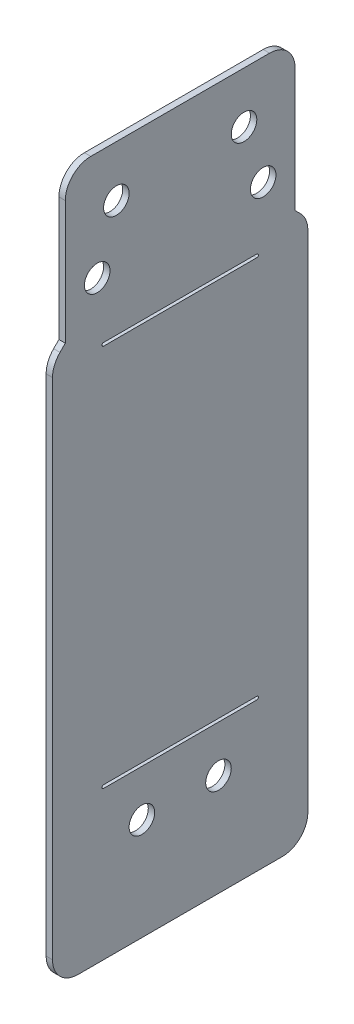
ISO-10303-21;
HEADER;
FILE_DESCRIPTION(('STEP AP214'),'2;1');
FILE_NAME('part.step','',(''),(''),'','','');
FILE_SCHEMA(('AUTOMOTIVE_DESIGN { 1 0 10303 214 1 1 1 1 }'));
ENDSEC;
DATA;
#1=APPLICATION_CONTEXT('core data for automotive mechanical design processes');
#2=APPLICATION_PROTOCOL_DEFINITION('international standard','automotive_design',2000,#1);
#3=PRODUCT_CONTEXT('',#1,'mechanical');
#4=PRODUCT('Part','Part','',(#3));
#5=PRODUCT_RELATED_PRODUCT_CATEGORY('part','',(#4));
#6=PRODUCT_DEFINITION_FORMATION('','',#4);
#7=PRODUCT_DEFINITION_CONTEXT('part definition',#1,'design');
#8=PRODUCT_DEFINITION('design','',#6,#7);
#9=PRODUCT_DEFINITION_SHAPE('','',#8);
#10=(LENGTH_UNIT() NAMED_UNIT(*) SI_UNIT(.MILLI.,.METRE.));
#11=(NAMED_UNIT(*) PLANE_ANGLE_UNIT() SI_UNIT($,.RADIAN.));
#12=(NAMED_UNIT(*) SI_UNIT($,.STERADIAN.) SOLID_ANGLE_UNIT());
#13=UNCERTAINTY_MEASURE_WITH_UNIT(LENGTH_MEASURE(1.E-05),#10,'distance_accuracy_value','');
#14=(GEOMETRIC_REPRESENTATION_CONTEXT(3) GLOBAL_UNCERTAINTY_ASSIGNED_CONTEXT((#13)) GLOBAL_UNIT_ASSIGNED_CONTEXT((#10,
#11,#12)) REPRESENTATION_CONTEXT('',''));
#15=CARTESIAN_POINT('',(0.,0.,0.));
#16=DIRECTION('',(0.,0.,1.));
#17=DIRECTION('',(1.,0.,0.));
#18=AXIS2_PLACEMENT_3D('',#15,#16,#17);
#19=CARTESIAN_POINT('',(1.,0.,-18.));
#20=DIRECTION('',(0.,0.,-1.));
#21=DIRECTION('',(0.,1.,0.));
#22=AXIS2_PLACEMENT_3D('',#19,#20,#21);
#23=PLANE('',#22);
#24=DIRECTION('',(0.,-1.,0.));
#25=VECTOR('',#24,1.);
#26=CARTESIAN_POINT('',(0.,0.,-18.));
#27=LINE('',#26,#25);
#28=CARTESIAN_POINT('',(0.,-3.99999999999999,-18.));
#29=VERTEX_POINT('',#28);
#30=CARTESIAN_POINT('',(0.,-23.35,-18.));
#31=VERTEX_POINT('',#30);
#32=EDGE_CURVE('E340',#29,#31,#27,.T.);
#33=ORIENTED_EDGE('',*,*,#32,.F.);
#34=DIRECTION('',(-1.,0.,0.));
#35=VECTOR('',#34,1.);
#36=CARTESIAN_POINT('',(1.,-3.99999999999999,-18.));
#37=LINE('',#36,#35);
#38=CARTESIAN_POINT('',(1.,-3.99999999999999,-18.));
#39=VERTEX_POINT('',#38);
#40=EDGE_CURVE('E362',#29,#39,#37,.F.);
#41=ORIENTED_EDGE('',*,*,#40,.T.);
#42=DIRECTION('',(0.,-1.,0.));
#43=VECTOR('',#42,1.);
#44=CARTESIAN_POINT('',(1.,0.,-18.));
#45=LINE('',#44,#43);
#46=CARTESIAN_POINT('',(1.00000000000003,-23.35,-18.));
#47=VERTEX_POINT('',#46);
#48=EDGE_CURVE('E328',#39,#47,#45,.T.);
#49=ORIENTED_EDGE('',*,*,#48,.T.);
#50=DIRECTION('',(-1.,0.,0.));
#51=VECTOR('',#50,1.);
#52=CARTESIAN_POINT('',(87.6730782884743,-23.35,-18.));
#53=LINE('',#52,#51);
#54=EDGE_CURVE('E265',#47,#31,#53,.T.);
#55=ORIENTED_EDGE('',*,*,#54,.T.);
#56=EDGE_LOOP('',(#33,#41,#49,#55));
#57=FACE_BOUND('',#56,.T.);
#58=ADVANCED_FACE('F36',(#57),#23,.T.);
#59=CARTESIAN_POINT('',(1.,0.,18.));
#60=DIRECTION('',(0.,0.,-1.));
#61=DIRECTION('',(0.,1.,0.));
#62=AXIS2_PLACEMENT_3D('',#59,#60,#61);
#63=PLANE('',#62);
#64=DIRECTION('',(0.,-1.,0.));
#65=VECTOR('',#64,1.);
#66=CARTESIAN_POINT('',(1.,0.,18.));
#67=LINE('',#66,#65);
#68=CARTESIAN_POINT('',(1.,-4.,18.));
#69=VERTEX_POINT('',#68);
#70=CARTESIAN_POINT('',(1.,-23.35,18.));
#71=VERTEX_POINT('',#70);
#72=EDGE_CURVE('E335',#69,#71,#67,.T.);
#73=ORIENTED_EDGE('',*,*,#72,.F.);
#74=DIRECTION('',(-1.,0.,0.));
#75=VECTOR('',#74,1.);
#76=CARTESIAN_POINT('',(0.,-4.,18.));
#77=LINE('',#76,#75);
#78=CARTESIAN_POINT('',(0.,-4.,18.));
#79=VERTEX_POINT('',#78);
#80=EDGE_CURVE('E337',#69,#79,#77,.T.);
#81=ORIENTED_EDGE('',*,*,#80,.T.);
#82=DIRECTION('',(0.,-1.,0.));
#83=VECTOR('',#82,1.);
#84=CARTESIAN_POINT('',(0.,0.,18.));
#85=LINE('',#84,#83);
#86=CARTESIAN_POINT('',(0.,-23.35,18.));
#87=VERTEX_POINT('',#86);
#88=EDGE_CURVE('E329',#79,#87,#85,.T.);
#89=ORIENTED_EDGE('',*,*,#88,.T.);
#90=DIRECTION('',(-1.,0.,0.));
#91=VECTOR('',#90,1.);
#92=CARTESIAN_POINT('',(87.6730782884743,-23.35,18.));
#93=LINE('',#92,#91);
#94=EDGE_CURVE('E279',#71,#87,#93,.T.);
#95=ORIENTED_EDGE('',*,*,#94,.F.);
#96=EDGE_LOOP('',(#73,#81,#89,#95));
#97=FACE_BOUND('',#96,.T.);
#98=ADVANCED_FACE('F436',(#97),#63,.F.);
#99=CARTESIAN_POINT('',(1.,0.,18.));
#100=DIRECTION('',(0.,1.,0.));
#101=DIRECTION('',(0.,0.,1.));
#102=AXIS2_PLACEMENT_3D('',#99,#100,#101);
#103=PLANE('',#102);
#104=DIRECTION('',(0.,0.,-1.));
#105=VECTOR('',#104,1.);
#106=CARTESIAN_POINT('',(0.,0.,18.));
#107=LINE('',#106,#105);
#108=CARTESIAN_POINT('',(0.,0.,14.));
#109=VERTEX_POINT('',#108);
#110=CARTESIAN_POINT('',(0.,0.,-14.));
#111=VERTEX_POINT('',#110);
#112=EDGE_CURVE('E324',#109,#111,#107,.T.);
#113=ORIENTED_EDGE('',*,*,#112,.F.);
#114=DIRECTION('',(-1.,0.,0.));
#115=VECTOR('',#114,1.);
#116=CARTESIAN_POINT('',(1.,0.,14.));
#117=LINE('',#116,#115);
#118=CARTESIAN_POINT('',(1.,0.,14.));
#119=VERTEX_POINT('',#118);
#120=EDGE_CURVE('E356',#109,#119,#117,.F.);
#121=ORIENTED_EDGE('',*,*,#120,.T.);
#122=DIRECTION('',(0.,0.,-1.));
#123=VECTOR('',#122,1.);
#124=CARTESIAN_POINT('',(1.,0.,18.));
#125=LINE('',#124,#123);
#126=CARTESIAN_POINT('',(1.,0.,-14.));
#127=VERTEX_POINT('',#126);
#128=EDGE_CURVE('E325',#119,#127,#125,.T.);
#129=ORIENTED_EDGE('',*,*,#128,.T.);
#130=DIRECTION('',(-1.,0.,0.));
#131=VECTOR('',#130,1.);
#132=CARTESIAN_POINT('',(1.,0.,-14.));
#133=LINE('',#132,#131);
#134=EDGE_CURVE('E353',#127,#111,#133,.T.);
#135=ORIENTED_EDGE('',*,*,#134,.T.);
#136=EDGE_LOOP('',(#113,#121,#129,#135));
#137=FACE_BOUND('',#136,.T.);
#138=ADVANCED_FACE('F428',(#137),#103,.T.);
#139=CARTESIAN_POINT('',(1.,-110.,18.));
#140=DIRECTION('',(0.,1.,0.));
#141=DIRECTION('',(0.,0.,1.));
#142=AXIS2_PLACEMENT_3D('',#139,#140,#141);
#143=PLANE('',#142);
#144=DIRECTION('',(0.,0.,-1.));
#145=VECTOR('',#144,1.);
#146=CARTESIAN_POINT('',(0.,-110.,18.));
#147=LINE('',#146,#145);
#148=CARTESIAN_POINT('',(0.,-110.,16.));
#149=VERTEX_POINT('',#148);
#150=CARTESIAN_POINT('',(0.,-110.,-16.));
#151=VERTEX_POINT('',#150);
#152=EDGE_CURVE('E342',#149,#151,#147,.T.);
#153=ORIENTED_EDGE('',*,*,#152,.T.);
#154=DIRECTION('',(-1.,0.,0.));
#155=VECTOR('',#154,1.);
#156=CARTESIAN_POINT('',(1.,-110.,-16.));
#157=LINE('',#156,#155);
#158=CARTESIAN_POINT('',(1.,-110.,-16.));
#159=VERTEX_POINT('',#158);
#160=EDGE_CURVE('E11',#151,#159,#157,.F.);
#161=ORIENTED_EDGE('',*,*,#160,.T.);
#162=DIRECTION('',(0.,0.,-1.));
#163=VECTOR('',#162,1.);
#164=CARTESIAN_POINT('',(1.,-110.,18.));
#165=LINE('',#164,#163);
#166=CARTESIAN_POINT('',(1.,-110.,16.));
#167=VERTEX_POINT('',#166);
#168=EDGE_CURVE('E332',#167,#159,#165,.T.);
#169=ORIENTED_EDGE('',*,*,#168,.F.);
#170=DIRECTION('',(-1.,0.,0.));
#171=VECTOR('',#170,1.);
#172=CARTESIAN_POINT('',(0.,-110.,16.));
#173=LINE('',#172,#171);
#174=EDGE_CURVE('E44',#167,#149,#173,.T.);
#175=ORIENTED_EDGE('',*,*,#174,.T.);
#176=EDGE_LOOP('',(#153,#161,#169,#175));
#177=FACE_BOUND('',#176,.T.);
#178=ADVANCED_FACE('F397',(#177),#143,.F.);
#179=CARTESIAN_POINT('',(1.,0.,0.));
#180=DIRECTION('',(-1.,0.,0.));
#181=DIRECTION('',(0.,0.,1.));
#182=AXIS2_PLACEMENT_3D('',#179,#180,#181);
#183=PLANE('',#182);
#184=DIRECTION('',(0.,0.,1.));
#185=VECTOR('',#184,1.);
#186=CARTESIAN_POINT('',(1.00000000000003,-86.75,12.));
#187=LINE('',#186,#185);
#188=CARTESIAN_POINT('',(1.00000000000003,-86.75,-12.));
#189=VERTEX_POINT('',#188);
#190=CARTESIAN_POINT('',(1.00000000000003,-86.75,12.));
#191=VERTEX_POINT('',#190);
#192=EDGE_CURVE('E198',#189,#191,#187,.T.);
#193=ORIENTED_EDGE('',*,*,#192,.T.);
#194=CARTESIAN_POINT('',(1.00000000000003,-86.5,12.));
#195=DIRECTION('',(-1.,0.,0.));
#196=DIRECTION('',(0.,0.,1.));
#197=AXIS2_PLACEMENT_3D('',#194,#195,#196);
#198=CIRCLE('',#197,0.250000000000014);
#199=CARTESIAN_POINT('',(1.00000000000003,-86.25,12.));
#200=VERTEX_POINT('',#199);
#201=EDGE_CURVE('E190',#191,#200,#198,.T.);
#202=ORIENTED_EDGE('',*,*,#201,.T.);
#203=DIRECTION('',(0.,0.,-1.));
#204=VECTOR('',#203,1.);
#205=CARTESIAN_POINT('',(1.00000000000003,-86.25,12.));
#206=LINE('',#205,#204);
#207=CARTESIAN_POINT('',(1.,-86.25,-12.));
#208=VERTEX_POINT('',#207);
#209=EDGE_CURVE('E202',#200,#208,#206,.T.);
#210=ORIENTED_EDGE('',*,*,#209,.T.);
#211=CARTESIAN_POINT('',(1.00000000000003,-86.5,-12.));
#212=DIRECTION('',(-1.,0.,0.));
#213=DIRECTION('',(0.,0.,1.));
#214=AXIS2_PLACEMENT_3D('',#211,#212,#213);
#215=CIRCLE('',#214,0.250000000000014);
#216=EDGE_CURVE('E206',#208,#189,#215,.T.);
#217=ORIENTED_EDGE('',*,*,#216,.T.);
#218=EDGE_LOOP('',(#193,#202,#210,#217));
#219=FACE_BOUND('',#218,.T.);
#220=DIRECTION('',(0.,0.,1.));
#221=VECTOR('',#220,1.);
#222=CARTESIAN_POINT('',(1.00000000000003,-26.75,12.));
#223=LINE('',#222,#221);
#224=CARTESIAN_POINT('',(1.00000000000003,-26.75,-12.));
#225=VERTEX_POINT('',#224);
#226=CARTESIAN_POINT('',(1.00000000000003,-26.75,12.));
#227=VERTEX_POINT('',#226);
#228=EDGE_CURVE('E241',#225,#227,#223,.T.);
#229=ORIENTED_EDGE('',*,*,#228,.T.);
#230=CARTESIAN_POINT('',(1.00000000000003,-26.5,12.));
#231=DIRECTION('',(-1.,0.,0.));
#232=DIRECTION('',(0.,0.,1.));
#233=AXIS2_PLACEMENT_3D('',#230,#231,#232);
#234=CIRCLE('',#233,0.25);
#235=CARTESIAN_POINT('',(1.00000000000003,-26.25,12.));
#236=VERTEX_POINT('',#235);
#237=EDGE_CURVE('E231',#227,#236,#234,.T.);
#238=ORIENTED_EDGE('',*,*,#237,.T.);
#239=DIRECTION('',(0.,0.,-1.));
#240=VECTOR('',#239,1.);
#241=CARTESIAN_POINT('',(1.00000000000003,-26.25,12.));
#242=LINE('',#241,#240);
#243=CARTESIAN_POINT('',(1.,-26.25,-12.));
#244=VERTEX_POINT('',#243);
#245=EDGE_CURVE('E234',#236,#244,#242,.T.);
#246=ORIENTED_EDGE('',*,*,#245,.T.);
#247=CARTESIAN_POINT('',(1.00000000000003,-26.5,-12.));
#248=DIRECTION('',(-1.,0.,0.));
#249=DIRECTION('',(0.,0.,1.));
#250=AXIS2_PLACEMENT_3D('',#247,#248,#249);
#251=CIRCLE('',#250,0.25);
#252=EDGE_CURVE('E238',#244,#225,#251,.T.);
#253=ORIENTED_EDGE('',*,*,#252,.T.);
#254=EDGE_LOOP('',(#229,#238,#246,#253));
#255=FACE_BOUND('',#254,.T.);
#256=CARTESIAN_POINT('',(1.,-94.,-6.00000000000001));
#257=DIRECTION('',(1.,0.,0.));
#258=DIRECTION('',(0.,0.,-1.));
#259=AXIS2_PLACEMENT_3D('',#256,#257,#258);
#260=CIRCLE('',#259,2.);
#261=CARTESIAN_POINT('',(1.,-94.,-8.00000000000001));
#262=VERTEX_POINT('',#261);
#263=EDGE_CURVE('E282',#262,#262,#260,.T.);
#264=ORIENTED_EDGE('',*,*,#263,.F.);
#265=EDGE_LOOP('',(#264));
#266=FACE_BOUND('',#265,.T.);
#267=CARTESIAN_POINT('',(1.,-94.,5.99999999999999));
#268=DIRECTION('',(1.,0.,0.));
#269=DIRECTION('',(0.,0.,-1.));
#270=AXIS2_PLACEMENT_3D('',#267,#268,#269);
#271=CIRCLE('',#270,2.);
#272=CARTESIAN_POINT('',(1.,-94.,3.99999999999999));
#273=VERTEX_POINT('',#272);
#274=EDGE_CURVE('E294',#273,#273,#271,.T.);
#275=ORIENTED_EDGE('',*,*,#274,.F.);
#276=EDGE_LOOP('',(#275));
#277=FACE_BOUND('',#276,.T.);
#278=CARTESIAN_POINT('',(1.,-17.,-13.));
#279=DIRECTION('',(-1.,0.,0.));
#280=DIRECTION('',(0.,0.,1.));
#281=AXIS2_PLACEMENT_3D('',#278,#279,#280);
#282=CIRCLE('',#281,2.);
#283=CARTESIAN_POINT('',(1.,-17.,-11.));
#284=VERTEX_POINT('',#283);
#285=EDGE_CURVE('E303',#284,#284,#282,.T.);
#286=ORIENTED_EDGE('',*,*,#285,.T.);
#287=EDGE_LOOP('',(#286));
#288=FACE_BOUND('',#287,.T.);
#289=CARTESIAN_POINT('',(1.,-17.,13.));
#290=DIRECTION('',(-1.,0.,0.));
#291=DIRECTION('',(0.,0.,1.));
#292=AXIS2_PLACEMENT_3D('',#289,#290,#291);
#293=CIRCLE('',#292,2.);
#294=CARTESIAN_POINT('',(1.,-17.,15.));
#295=VERTEX_POINT('',#294);
#296=EDGE_CURVE('E309',#295,#295,#293,.T.);
#297=ORIENTED_EDGE('',*,*,#296,.T.);
#298=EDGE_LOOP('',(#297));
#299=FACE_BOUND('',#298,.T.);
#300=CARTESIAN_POINT('',(1.,-8.,-9.99999999999999));
#301=DIRECTION('',(-1.,0.,0.));
#302=DIRECTION('',(0.,0.,1.));
#303=AXIS2_PLACEMENT_3D('',#300,#301,#302);
#304=CIRCLE('',#303,2.);
#305=CARTESIAN_POINT('',(1.,-8.,-7.99999999999999));
#306=VERTEX_POINT('',#305);
#307=EDGE_CURVE('E315',#306,#306,#304,.T.);
#308=ORIENTED_EDGE('',*,*,#307,.T.);
#309=EDGE_LOOP('',(#308));
#310=FACE_BOUND('',#309,.T.);
#311=CARTESIAN_POINT('',(1.,-8.,10.));
#312=DIRECTION('',(-1.,0.,0.));
#313=DIRECTION('',(0.,0.,1.));
#314=AXIS2_PLACEMENT_3D('',#311,#312,#313);
#315=CIRCLE('',#314,2.);
#316=CARTESIAN_POINT('',(1.,-8.,12.));
#317=VERTEX_POINT('',#316);
#318=EDGE_CURVE('E321',#317,#317,#315,.T.);
#319=ORIENTED_EDGE('',*,*,#318,.T.);
#320=EDGE_LOOP('',(#319));
#321=FACE_BOUND('',#320,.T.);
#322=DIRECTION('',(0.,-0.707106781186551,0.707106781186544));
#323=VECTOR('',#322,1.);
#324=CARTESIAN_POINT('',(1.,-23.35,18.));
#325=LINE('',#324,#323);
#326=CARTESIAN_POINT('',(1.,-24.1784271247462,18.8284271247462));
#327=VERTEX_POINT('',#326);
#328=EDGE_CURVE('E278',#71,#327,#325,.T.);
#329=ORIENTED_EDGE('',*,*,#328,.T.);
#330=CARTESIAN_POINT('',(1.,-27.0068542494924,16.));
#331=DIRECTION('',(-1.,0.,0.));
#332=DIRECTION('',(0.,0.,1.));
#333=AXIS2_PLACEMENT_3D('',#330,#331,#332);
#334=CIRCLE('',#333,4.);
#335=CARTESIAN_POINT('',(1.,-27.0068542494924,20.));
#336=VERTEX_POINT('',#335);
#337=EDGE_CURVE('E384',#327,#336,#334,.F.);
#338=ORIENTED_EDGE('',*,*,#337,.T.);
#339=DIRECTION('',(0.,-1.,0.));
#340=VECTOR('',#339,1.);
#341=CARTESIAN_POINT('',(1.,-25.35,20.));
#342=LINE('',#341,#340);
#343=CARTESIAN_POINT('',(1.,-106.,20.));
#344=VERTEX_POINT('',#343);
#345=EDGE_CURVE('E275',#336,#344,#342,.T.);
#346=ORIENTED_EDGE('',*,*,#345,.T.);
#347=CARTESIAN_POINT('',(1.,-106.,16.));
#348=DIRECTION('',(-1.,0.,0.));
#349=DIRECTION('',(0.,0.,1.));
#350=AXIS2_PLACEMENT_3D('',#347,#348,#349);
#351=CIRCLE('',#350,4.);
#352=EDGE_CURVE('E379',#344,#167,#351,.F.);
#353=ORIENTED_EDGE('',*,*,#352,.T.);
#354=ORIENTED_EDGE('',*,*,#168,.T.);
#355=CARTESIAN_POINT('',(1.,-106.,-16.));
#356=DIRECTION('',(-1.,0.,0.));
#357=DIRECTION('',(0.,0.,1.));
#358=AXIS2_PLACEMENT_3D('',#355,#356,#357);
#359=CIRCLE('',#358,4.);
#360=CARTESIAN_POINT('',(1.,-106.,-20.));
#361=VERTEX_POINT('',#360);
#362=EDGE_CURVE('E381',#159,#361,#359,.F.);
#363=ORIENTED_EDGE('',*,*,#362,.T.);
#364=DIRECTION('',(0.,1.,0.));
#365=VECTOR('',#364,1.);
#366=CARTESIAN_POINT('',(1.,-25.35,-20.));
#367=LINE('',#366,#365);
#368=CARTESIAN_POINT('',(1.,-27.0068542494924,-20.));
#369=VERTEX_POINT('',#368);
#370=EDGE_CURVE('E264',#361,#369,#367,.T.);
#371=ORIENTED_EDGE('',*,*,#370,.T.);
#372=CARTESIAN_POINT('',(1.,-27.0068542494924,-16.));
#373=DIRECTION('',(-1.,0.,0.));
#374=DIRECTION('',(0.,0.,1.));
#375=AXIS2_PLACEMENT_3D('',#372,#373,#374);
#376=CIRCLE('',#375,4.);
#377=CARTESIAN_POINT('',(1.,-24.1784271247462,-18.8284271247462));
#378=VERTEX_POINT('',#377);
#379=EDGE_CURVE('E51',#369,#378,#376,.F.);
#380=ORIENTED_EDGE('',*,*,#379,.T.);
#381=DIRECTION('',(0.,0.707106781186551,0.707106781186544));
#382=VECTOR('',#381,1.);
#383=CARTESIAN_POINT('',(1.,-23.35,-18.));
#384=LINE('',#383,#382);
#385=EDGE_CURVE('E262',#378,#47,#384,.T.);
#386=ORIENTED_EDGE('',*,*,#385,.T.);
#387=ORIENTED_EDGE('',*,*,#48,.F.);
#388=CARTESIAN_POINT('',(1.,-3.99999999999999,-14.));
#389=DIRECTION('',(-1.,0.,0.));
#390=DIRECTION('',(0.,0.,1.));
#391=AXIS2_PLACEMENT_3D('',#388,#389,#390);
#392=CIRCLE('',#391,4.);
#393=EDGE_CURVE('E358',#39,#127,#392,.F.);
#394=ORIENTED_EDGE('',*,*,#393,.T.);
#395=ORIENTED_EDGE('',*,*,#128,.F.);
#396=CARTESIAN_POINT('',(1.,-4.,14.));
#397=DIRECTION('',(-1.,0.,0.));
#398=DIRECTION('',(0.,0.,1.));
#399=AXIS2_PLACEMENT_3D('',#396,#397,#398);
#400=CIRCLE('',#399,4.);
#401=EDGE_CURVE('E360',#119,#69,#400,.F.);
#402=ORIENTED_EDGE('',*,*,#401,.T.);
#403=ORIENTED_EDGE('',*,*,#72,.T.);
#404=EDGE_LOOP('',(#329,#338,#346,#353,#354,#363,#371,#380,#386,#387,#394,#395,#402,#403));
#405=FACE_BOUND('',#404,.T.);
#406=ADVANCED_FACE('F208',(#219,#255,#266,#277,#288,#299,#310,#321,#405),#183,.F.);
#407=CARTESIAN_POINT('',(0.,0.,0.));
#408=DIRECTION('',(-1.,0.,0.));
#409=DIRECTION('',(0.,0.,1.));
#410=AXIS2_PLACEMENT_3D('',#407,#408,#409);
#411=PLANE('',#410);
#412=CARTESIAN_POINT('',(0.,-86.5,12.));
#413=DIRECTION('',(-1.,0.,0.));
#414=DIRECTION('',(0.,0.,1.));
#415=AXIS2_PLACEMENT_3D('',#412,#413,#414);
#416=CIRCLE('',#415,0.250000000000014);
#417=CARTESIAN_POINT('',(0.,-86.75,12.));
#418=VERTEX_POINT('',#417);
#419=CARTESIAN_POINT('',(0.,-86.25,12.));
#420=VERTEX_POINT('',#419);
#421=EDGE_CURVE('E193',#418,#420,#416,.T.);
#422=ORIENTED_EDGE('',*,*,#421,.F.);
#423=DIRECTION('',(0.,0.,1.));
#424=VECTOR('',#423,1.);
#425=CARTESIAN_POINT('',(0.,-86.75,12.));
#426=LINE('',#425,#424);
#427=CARTESIAN_POINT('',(0.,-86.75,-12.));
#428=VERTEX_POINT('',#427);
#429=EDGE_CURVE('E211',#428,#418,#426,.T.);
#430=ORIENTED_EDGE('',*,*,#429,.F.);
#431=CARTESIAN_POINT('',(0.,-86.5,-12.));
#432=DIRECTION('',(-1.,0.,0.));
#433=DIRECTION('',(0.,0.,1.));
#434=AXIS2_PLACEMENT_3D('',#431,#432,#433);
#435=CIRCLE('',#434,0.250000000000014);
#436=CARTESIAN_POINT('',(0.,-86.25,-12.));
#437=VERTEX_POINT('',#436);
#438=EDGE_CURVE('E214',#437,#428,#435,.T.);
#439=ORIENTED_EDGE('',*,*,#438,.F.);
#440=DIRECTION('',(0.,0.,-1.));
#441=VECTOR('',#440,1.);
#442=CARTESIAN_POINT('',(0.,-86.25,12.));
#443=LINE('',#442,#441);
#444=EDGE_CURVE('E220',#420,#437,#443,.T.);
#445=ORIENTED_EDGE('',*,*,#444,.F.);
#446=EDGE_LOOP('',(#422,#430,#439,#445));
#447=FACE_BOUND('',#446,.T.);
#448=CARTESIAN_POINT('',(0.,-26.5,12.));
#449=DIRECTION('',(-1.,0.,0.));
#450=DIRECTION('',(0.,0.,1.));
#451=AXIS2_PLACEMENT_3D('',#448,#449,#450);
#452=CIRCLE('',#451,0.25);
#453=CARTESIAN_POINT('',(0.,-26.75,12.));
#454=VERTEX_POINT('',#453);
#455=CARTESIAN_POINT('',(0.,-26.25,12.));
#456=VERTEX_POINT('',#455);
#457=EDGE_CURVE('E245',#454,#456,#452,.T.);
#458=ORIENTED_EDGE('',*,*,#457,.F.);
#459=DIRECTION('',(0.,0.,1.));
#460=VECTOR('',#459,1.);
#461=CARTESIAN_POINT('',(0.,-26.75,12.));
#462=LINE('',#461,#460);
#463=CARTESIAN_POINT('',(0.,-26.75,-12.));
#464=VERTEX_POINT('',#463);
#465=EDGE_CURVE('E235',#464,#454,#462,.T.);
#466=ORIENTED_EDGE('',*,*,#465,.F.);
#467=CARTESIAN_POINT('',(0.,-26.5,-12.));
#468=DIRECTION('',(-1.,0.,0.));
#469=DIRECTION('',(0.,0.,1.));
#470=AXIS2_PLACEMENT_3D('',#467,#468,#469);
#471=CIRCLE('',#470,0.25);
#472=CARTESIAN_POINT('',(0.,-26.25,-12.));
#473=VERTEX_POINT('',#472);
#474=EDGE_CURVE('E250',#473,#464,#471,.T.);
#475=ORIENTED_EDGE('',*,*,#474,.F.);
#476=DIRECTION('',(0.,0.,-1.));
#477=VECTOR('',#476,1.);
#478=CARTESIAN_POINT('',(0.,-26.25,12.));
#479=LINE('',#478,#477);
#480=EDGE_CURVE('E247',#456,#473,#479,.T.);
#481=ORIENTED_EDGE('',*,*,#480,.F.);
#482=EDGE_LOOP('',(#458,#466,#475,#481));
#483=FACE_BOUND('',#482,.T.);
#484=CARTESIAN_POINT('',(0.,-94.,-6.00000000000001));
#485=DIRECTION('',(1.,0.,0.));
#486=DIRECTION('',(0.,0.,-1.));
#487=AXIS2_PLACEMENT_3D('',#484,#485,#486);
#488=CIRCLE('',#487,2.);
#489=CARTESIAN_POINT('',(0.,-94.,-8.00000000000001));
#490=VERTEX_POINT('',#489);
#491=EDGE_CURVE('E291',#490,#490,#488,.T.);
#492=ORIENTED_EDGE('',*,*,#491,.T.);
#493=EDGE_LOOP('',(#492));
#494=FACE_BOUND('',#493,.T.);
#495=CARTESIAN_POINT('',(0.,-94.,5.99999999999999));
#496=DIRECTION('',(1.,0.,0.));
#497=DIRECTION('',(0.,0.,-1.));
#498=AXIS2_PLACEMENT_3D('',#495,#496,#497);
#499=CIRCLE('',#498,2.);
#500=CARTESIAN_POINT('',(0.,-94.,3.99999999999999));
#501=VERTEX_POINT('',#500);
#502=EDGE_CURVE('E297',#501,#501,#499,.T.);
#503=ORIENTED_EDGE('',*,*,#502,.T.);
#504=EDGE_LOOP('',(#503));
#505=FACE_BOUND('',#504,.T.);
#506=CARTESIAN_POINT('',(0.,-17.,-13.));
#507=DIRECTION('',(-1.,0.,0.));
#508=DIRECTION('',(0.,0.,1.));
#509=AXIS2_PLACEMENT_3D('',#506,#507,#508);
#510=CIRCLE('',#509,2.);
#511=CARTESIAN_POINT('',(0.,-17.,-11.));
#512=VERTEX_POINT('',#511);
#513=EDGE_CURVE('E300',#512,#512,#510,.T.);
#514=ORIENTED_EDGE('',*,*,#513,.F.);
#515=EDGE_LOOP('',(#514));
#516=FACE_BOUND('',#515,.T.);
#517=CARTESIAN_POINT('',(0.,-17.,13.));
#518=DIRECTION('',(-1.,0.,0.));
#519=DIRECTION('',(0.,0.,1.));
#520=AXIS2_PLACEMENT_3D('',#517,#518,#519);
#521=CIRCLE('',#520,2.);
#522=CARTESIAN_POINT('',(0.,-17.,15.));
#523=VERTEX_POINT('',#522);
#524=EDGE_CURVE('E306',#523,#523,#521,.T.);
#525=ORIENTED_EDGE('',*,*,#524,.F.);
#526=EDGE_LOOP('',(#525));
#527=FACE_BOUND('',#526,.T.);
#528=CARTESIAN_POINT('',(0.,-8.,-9.99999999999999));
#529=DIRECTION('',(-1.,0.,0.));
#530=DIRECTION('',(0.,0.,1.));
#531=AXIS2_PLACEMENT_3D('',#528,#529,#530);
#532=CIRCLE('',#531,2.);
#533=CARTESIAN_POINT('',(0.,-8.,-7.99999999999999));
#534=VERTEX_POINT('',#533);
#535=EDGE_CURVE('E312',#534,#534,#532,.T.);
#536=ORIENTED_EDGE('',*,*,#535,.F.);
#537=EDGE_LOOP('',(#536));
#538=FACE_BOUND('',#537,.T.);
#539=CARTESIAN_POINT('',(0.,-8.,10.));
#540=DIRECTION('',(-1.,0.,0.));
#541=DIRECTION('',(0.,0.,1.));
#542=AXIS2_PLACEMENT_3D('',#539,#540,#541);
#543=CIRCLE('',#542,2.);
#544=CARTESIAN_POINT('',(0.,-8.,12.));
#545=VERTEX_POINT('',#544);
#546=EDGE_CURVE('E318',#545,#545,#543,.T.);
#547=ORIENTED_EDGE('',*,*,#546,.F.);
#548=EDGE_LOOP('',(#547));
#549=FACE_BOUND('',#548,.T.);
#550=DIRECTION('',(0.,1.,0.));
#551=VECTOR('',#550,1.);
#552=CARTESIAN_POINT('',(0.,-25.35,20.));
#553=LINE('',#552,#551);
#554=CARTESIAN_POINT('',(0.,-106.,20.));
#555=VERTEX_POINT('',#554);
#556=CARTESIAN_POINT('',(0.,-27.0068542494924,20.));
#557=VERTEX_POINT('',#556);
#558=EDGE_CURVE('E267',#555,#557,#553,.T.);
#559=ORIENTED_EDGE('',*,*,#558,.T.);
#560=CARTESIAN_POINT('',(0.,-27.0068542494924,16.));
#561=DIRECTION('',(-1.,0.,0.));
#562=DIRECTION('',(0.,0.,1.));
#563=AXIS2_PLACEMENT_3D('',#560,#561,#562);
#564=CIRCLE('',#563,4.);
#565=CARTESIAN_POINT('',(0.,-24.1784271247462,18.8284271247462));
#566=VERTEX_POINT('',#565);
#567=EDGE_CURVE('E375',#557,#566,#564,.T.);
#568=ORIENTED_EDGE('',*,*,#567,.T.);
#569=DIRECTION('',(0.,0.707106781186551,-0.707106781186544));
#570=VECTOR('',#569,1.);
#571=CARTESIAN_POINT('',(0.,-23.35,18.));
#572=LINE('',#571,#570);
#573=EDGE_CURVE('E285',#566,#87,#572,.T.);
#574=ORIENTED_EDGE('',*,*,#573,.T.);
#575=ORIENTED_EDGE('',*,*,#88,.F.);
#576=CARTESIAN_POINT('',(0.,-4.,14.));
#577=DIRECTION('',(-1.,0.,0.));
#578=DIRECTION('',(0.,0.,1.));
#579=AXIS2_PLACEMENT_3D('',#576,#577,#578);
#580=CIRCLE('',#579,4.);
#581=EDGE_CURVE('E351',#79,#109,#580,.T.);
#582=ORIENTED_EDGE('',*,*,#581,.T.);
#583=ORIENTED_EDGE('',*,*,#112,.T.);
#584=CARTESIAN_POINT('',(0.,-3.99999999999999,-14.));
#585=DIRECTION('',(-1.,0.,0.));
#586=DIRECTION('',(0.,0.,1.));
#587=AXIS2_PLACEMENT_3D('',#584,#585,#586);
#588=CIRCLE('',#587,4.);
#589=EDGE_CURVE('E349',#111,#29,#588,.T.);
#590=ORIENTED_EDGE('',*,*,#589,.T.);
#591=ORIENTED_EDGE('',*,*,#32,.T.);
#592=DIRECTION('',(0.,-0.707106781186551,-0.707106781186544));
#593=VECTOR('',#592,1.);
#594=CARTESIAN_POINT('',(0.,-23.35,-18.));
#595=LINE('',#594,#593);
#596=CARTESIAN_POINT('',(0.,-24.1784271247462,-18.8284271247462));
#597=VERTEX_POINT('',#596);
#598=EDGE_CURVE('E227',#31,#597,#595,.T.);
#599=ORIENTED_EDGE('',*,*,#598,.T.);
#600=CARTESIAN_POINT('',(0.,-27.0068542494924,-16.));
#601=DIRECTION('',(-1.,0.,0.));
#602=DIRECTION('',(0.,0.,1.));
#603=AXIS2_PLACEMENT_3D('',#600,#601,#602);
#604=CIRCLE('',#603,4.);
#605=CARTESIAN_POINT('',(0.,-27.0068542494924,-20.));
#606=VERTEX_POINT('',#605);
#607=EDGE_CURVE('E373',#597,#606,#604,.T.);
#608=ORIENTED_EDGE('',*,*,#607,.T.);
#609=DIRECTION('',(0.,-1.,0.));
#610=VECTOR('',#609,1.);
#611=CARTESIAN_POINT('',(0.,-25.35,-20.));
#612=LINE('',#611,#610);
#613=CARTESIAN_POINT('',(0.,-106.,-20.));
#614=VERTEX_POINT('',#613);
#615=EDGE_CURVE('E270',#606,#614,#612,.T.);
#616=ORIENTED_EDGE('',*,*,#615,.T.);
#617=CARTESIAN_POINT('',(0.,-106.,-16.));
#618=DIRECTION('',(-1.,0.,0.));
#619=DIRECTION('',(0.,0.,1.));
#620=AXIS2_PLACEMENT_3D('',#617,#618,#619);
#621=CIRCLE('',#620,4.);
#622=EDGE_CURVE('E371',#614,#151,#621,.T.);
#623=ORIENTED_EDGE('',*,*,#622,.T.);
#624=ORIENTED_EDGE('',*,*,#152,.F.);
#625=CARTESIAN_POINT('',(0.,-106.,16.));
#626=DIRECTION('',(-1.,0.,0.));
#627=DIRECTION('',(0.,0.,1.));
#628=AXIS2_PLACEMENT_3D('',#625,#626,#627);
#629=CIRCLE('',#628,4.);
#630=EDGE_CURVE('E369',#149,#555,#629,.T.);
#631=ORIENTED_EDGE('',*,*,#630,.T.);
#632=EDGE_LOOP('',(#559,#568,#574,#575,#582,#583,#590,#591,#599,#608,#616,#623,#624,#631));
#633=FACE_BOUND('',#632,.T.);
#634=ADVANCED_FACE('F402',(#447,#483,#494,#505,#516,#527,#538,#549,#633),#411,.T.);
#635=CARTESIAN_POINT('',(0.,-8.,10.));
#636=DIRECTION('',(-1.,0.,0.));
#637=DIRECTION('',(0.,0.,1.));
#638=AXIS2_PLACEMENT_3D('',#635,#636,#637);
#639=CYLINDRICAL_SURFACE('',#638,2.);
#640=ORIENTED_EDGE('',*,*,#318,.F.);
#641=EDGE_LOOP('',(#640));
#642=FACE_BOUND('',#641,.T.);
#643=ORIENTED_EDGE('',*,*,#546,.T.);
#644=EDGE_LOOP('',(#643));
#645=FACE_BOUND('',#644,.T.);
#646=ADVANCED_FACE('F609',(#642,#645),#639,.F.);
#647=CARTESIAN_POINT('',(0.,-8.,-9.99999999999999));
#648=DIRECTION('',(-1.,0.,0.));
#649=DIRECTION('',(0.,0.,1.));
#650=AXIS2_PLACEMENT_3D('',#647,#648,#649);
#651=CYLINDRICAL_SURFACE('',#650,2.);
#652=ORIENTED_EDGE('',*,*,#307,.F.);
#653=EDGE_LOOP('',(#652));
#654=FACE_BOUND('',#653,.T.);
#655=ORIENTED_EDGE('',*,*,#535,.T.);
#656=EDGE_LOOP('',(#655));
#657=FACE_BOUND('',#656,.T.);
#658=ADVANCED_FACE('F682',(#654,#657),#651,.F.);
#659=CARTESIAN_POINT('',(0.,-17.,13.));
#660=DIRECTION('',(-1.,0.,0.));
#661=DIRECTION('',(0.,0.,1.));
#662=AXIS2_PLACEMENT_3D('',#659,#660,#661);
#663=CYLINDRICAL_SURFACE('',#662,2.);
#664=ORIENTED_EDGE('',*,*,#296,.F.);
#665=EDGE_LOOP('',(#664));
#666=FACE_BOUND('',#665,.T.);
#667=ORIENTED_EDGE('',*,*,#524,.T.);
#668=EDGE_LOOP('',(#667));
#669=FACE_BOUND('',#668,.T.);
#670=ADVANCED_FACE('F672',(#666,#669),#663,.F.);
#671=CARTESIAN_POINT('',(0.,-17.,-13.));
#672=DIRECTION('',(-1.,0.,0.));
#673=DIRECTION('',(0.,0.,1.));
#674=AXIS2_PLACEMENT_3D('',#671,#672,#673);
#675=CYLINDRICAL_SURFACE('',#674,2.);
#676=ORIENTED_EDGE('',*,*,#285,.F.);
#677=EDGE_LOOP('',(#676));
#678=FACE_BOUND('',#677,.T.);
#679=ORIENTED_EDGE('',*,*,#513,.T.);
#680=EDGE_LOOP('',(#679));
#681=FACE_BOUND('',#680,.T.);
#682=ADVANCED_FACE('F662',(#678,#681),#675,.F.);
#683=CARTESIAN_POINT('',(1.,-94.,5.99999999999999));
#684=DIRECTION('',(1.,0.,0.));
#685=DIRECTION('',(0.,0.,-1.));
#686=AXIS2_PLACEMENT_3D('',#683,#684,#685);
#687=CYLINDRICAL_SURFACE('',#686,2.);
#688=ORIENTED_EDGE('',*,*,#502,.F.);
#689=EDGE_LOOP('',(#688));
#690=FACE_BOUND('',#689,.T.);
#691=ORIENTED_EDGE('',*,*,#274,.T.);
#692=EDGE_LOOP('',(#691));
#693=FACE_BOUND('',#692,.T.);
#694=ADVANCED_FACE('F652',(#690,#693),#687,.F.);
#695=CARTESIAN_POINT('',(1.,-94.,-6.00000000000001));
#696=DIRECTION('',(1.,0.,0.));
#697=DIRECTION('',(0.,0.,-1.));
#698=AXIS2_PLACEMENT_3D('',#695,#696,#697);
#699=CYLINDRICAL_SURFACE('',#698,2.);
#700=ORIENTED_EDGE('',*,*,#491,.F.);
#701=EDGE_LOOP('',(#700));
#702=FACE_BOUND('',#701,.T.);
#703=ORIENTED_EDGE('',*,*,#263,.T.);
#704=EDGE_LOOP('',(#703));
#705=FACE_BOUND('',#704,.T.);
#706=ADVANCED_FACE('F601',(#702,#705),#699,.F.);
#707=CARTESIAN_POINT('',(87.6730782884743,-23.35,18.));
#708=DIRECTION('',(0.,0.707106781186544,0.707106781186551));
#709=DIRECTION('',(0.,-0.707106781186551,0.707106781186544));
#710=AXIS2_PLACEMENT_3D('',#707,#708,#709);
#711=PLANE('',#710);
#712=ORIENTED_EDGE('',*,*,#573,.F.);
#713=DIRECTION('',(-1.,0.,0.));
#714=VECTOR('',#713,1.);
#715=CARTESIAN_POINT('',(87.6730782884743,-24.1784271247462,18.8284271247462));
#716=LINE('',#715,#714);
#717=EDGE_CURVE('E377',#566,#327,#716,.F.);
#718=ORIENTED_EDGE('',*,*,#717,.T.);
#719=ORIENTED_EDGE('',*,*,#328,.F.);
#720=ORIENTED_EDGE('',*,*,#94,.T.);
#721=EDGE_LOOP('',(#712,#718,#719,#720));
#722=FACE_BOUND('',#721,.T.);
#723=ADVANCED_FACE('F441',(#722),#711,.T.);
#724=CARTESIAN_POINT('',(87.6730782884743,-25.35,20.));
#725=DIRECTION('',(0.,0.,1.));
#726=DIRECTION('',(0.,-1.,0.));
#727=AXIS2_PLACEMENT_3D('',#724,#725,#726);
#728=PLANE('',#727);
#729=ORIENTED_EDGE('',*,*,#345,.F.);
#730=DIRECTION('',(-1.,0.,0.));
#731=VECTOR('',#730,1.);
#732=CARTESIAN_POINT('',(87.6730782884743,-27.0068542494924,20.));
#733=LINE('',#732,#731);
#734=EDGE_CURVE('E366',#336,#557,#733,.T.);
#735=ORIENTED_EDGE('',*,*,#734,.T.);
#736=ORIENTED_EDGE('',*,*,#558,.F.);
#737=DIRECTION('',(-1.,0.,0.));
#738=VECTOR('',#737,1.);
#739=CARTESIAN_POINT('',(1.00000000000003,-106.,20.));
#740=LINE('',#739,#738);
#741=EDGE_CURVE('E364',#555,#344,#740,.F.);
#742=ORIENTED_EDGE('',*,*,#741,.T.);
#743=EDGE_LOOP('',(#729,#735,#736,#742));
#744=FACE_BOUND('',#743,.T.);
#745=ADVANCED_FACE('F449',(#744),#728,.T.);
#746=CARTESIAN_POINT('',(87.6730782884743,-25.35,-20.));
#747=DIRECTION('',(0.,0.,-1.));
#748=DIRECTION('',(0.,1.,0.));
#749=AXIS2_PLACEMENT_3D('',#746,#747,#748);
#750=PLANE('',#749);
#751=ORIENTED_EDGE('',*,*,#615,.F.);
#752=DIRECTION('',(-1.,0.,0.));
#753=VECTOR('',#752,1.);
#754=CARTESIAN_POINT('',(87.6730782884743,-27.0068542494924,-20.));
#755=LINE('',#754,#753);
#756=EDGE_CURVE('E59',#606,#369,#755,.F.);
#757=ORIENTED_EDGE('',*,*,#756,.T.);
#758=ORIENTED_EDGE('',*,*,#370,.F.);
#759=DIRECTION('',(-1.,0.,0.));
#760=VECTOR('',#759,1.);
#761=CARTESIAN_POINT('',(0.,-106.,-20.));
#762=LINE('',#761,#760);
#763=EDGE_CURVE('E389',#361,#614,#762,.T.);
#764=ORIENTED_EDGE('',*,*,#763,.T.);
#765=EDGE_LOOP('',(#751,#757,#758,#764));
#766=FACE_BOUND('',#765,.T.);
#767=ADVANCED_FACE('F408',(#766),#750,.T.);
#768=CARTESIAN_POINT('',(87.6730782884743,-23.35,-18.));
#769=DIRECTION('',(0.,0.707106781186544,-0.707106781186551));
#770=DIRECTION('',(0.,0.707106781186551,0.707106781186544));
#771=AXIS2_PLACEMENT_3D('',#768,#769,#770);
#772=PLANE('',#771);
#773=ORIENTED_EDGE('',*,*,#385,.F.);
#774=DIRECTION('',(-1.,0.,0.));
#775=VECTOR('',#774,1.);
#776=CARTESIAN_POINT('',(87.6730782884743,-24.1784271247462,-18.8284271247462));
#777=LINE('',#776,#775);
#778=EDGE_CURVE('E386',#378,#597,#777,.T.);
#779=ORIENTED_EDGE('',*,*,#778,.T.);
#780=ORIENTED_EDGE('',*,*,#598,.F.);
#781=ORIENTED_EDGE('',*,*,#54,.F.);
#782=EDGE_LOOP('',(#773,#779,#780,#781));
#783=FACE_BOUND('',#782,.T.);
#784=ADVANCED_FACE('F414',(#783),#772,.T.);
#785=CARTESIAN_POINT('',(1.,-4.,14.));
#786=DIRECTION('',(1.,0.,0.));
#787=DIRECTION('',(0.,0.,-1.));
#788=AXIS2_PLACEMENT_3D('',#785,#786,#787);
#789=CYLINDRICAL_SURFACE('',#788,4.);
#790=ORIENTED_EDGE('',*,*,#401,.F.);
#791=ORIENTED_EDGE('',*,*,#120,.F.);
#792=ORIENTED_EDGE('',*,*,#581,.F.);
#793=ORIENTED_EDGE('',*,*,#80,.F.);
#794=EDGE_LOOP('',(#790,#791,#792,#793));
#795=FACE_BOUND('',#794,.T.);
#796=ADVANCED_FACE('F431',(#795),#789,.T.);
#797=CARTESIAN_POINT('',(1.,-3.99999999999999,-14.));
#798=DIRECTION('',(-1.,0.,0.));
#799=DIRECTION('',(0.,0.,1.));
#800=AXIS2_PLACEMENT_3D('',#797,#798,#799);
#801=CYLINDRICAL_SURFACE('',#800,4.);
#802=ORIENTED_EDGE('',*,*,#393,.F.);
#803=ORIENTED_EDGE('',*,*,#40,.F.);
#804=ORIENTED_EDGE('',*,*,#589,.F.);
#805=ORIENTED_EDGE('',*,*,#134,.F.);
#806=EDGE_LOOP('',(#802,#803,#804,#805));
#807=FACE_BOUND('',#806,.T.);
#808=ADVANCED_FACE('F422',(#807),#801,.T.);
#809=CARTESIAN_POINT('',(1.00000000000003,-26.5,12.));
#810=DIRECTION('',(-1.,0.,0.));
#811=DIRECTION('',(0.,0.,1.));
#812=AXIS2_PLACEMENT_3D('',#809,#810,#811);
#813=CYLINDRICAL_SURFACE('',#812,0.25);
#814=ORIENTED_EDGE('',*,*,#457,.T.);
#815=DIRECTION('',(-1.,0.,0.));
#816=VECTOR('',#815,1.);
#817=CARTESIAN_POINT('',(1.00000000000003,-26.25,12.));
#818=LINE('',#817,#816);
#819=EDGE_CURVE('E244',#236,#456,#818,.T.);
#820=ORIENTED_EDGE('',*,*,#819,.F.);
#821=ORIENTED_EDGE('',*,*,#237,.F.);
#822=DIRECTION('',(-1.,0.,0.));
#823=VECTOR('',#822,1.);
#824=CARTESIAN_POINT('',(1.00000000000003,-26.75,12.));
#825=LINE('',#824,#823);
#826=EDGE_CURVE('E221',#227,#454,#825,.T.);
#827=ORIENTED_EDGE('',*,*,#826,.T.);
#828=EDGE_LOOP('',(#814,#820,#821,#827));
#829=FACE_BOUND('',#828,.T.);
#830=ADVANCED_FACE('F469',(#829),#813,.F.);
#831=CARTESIAN_POINT('',(1.00000000000003,-26.75,12.));
#832=DIRECTION('',(0.,-1.,0.));
#833=DIRECTION('',(0.,0.,-1.));
#834=AXIS2_PLACEMENT_3D('',#831,#832,#833);
#835=PLANE('',#834);
#836=ORIENTED_EDGE('',*,*,#465,.T.);
#837=ORIENTED_EDGE('',*,*,#826,.F.);
#838=ORIENTED_EDGE('',*,*,#228,.F.);
#839=DIRECTION('',(-1.,0.,0.));
#840=VECTOR('',#839,1.);
#841=CARTESIAN_POINT('',(1.00000000000003,-26.75,-12.));
#842=LINE('',#841,#840);
#843=EDGE_CURVE('E256',#225,#464,#842,.T.);
#844=ORIENTED_EDGE('',*,*,#843,.T.);
#845=EDGE_LOOP('',(#836,#837,#838,#844));
#846=FACE_BOUND('',#845,.T.);
#847=ADVANCED_FACE('F545',(#846),#835,.F.);
#848=CARTESIAN_POINT('',(1.00000000000003,-26.5,-12.));
#849=DIRECTION('',(-1.,0.,0.));
#850=DIRECTION('',(0.,0.,1.));
#851=AXIS2_PLACEMENT_3D('',#848,#849,#850);
#852=CYLINDRICAL_SURFACE('',#851,0.25);
#853=ORIENTED_EDGE('',*,*,#474,.T.);
#854=ORIENTED_EDGE('',*,*,#843,.F.);
#855=ORIENTED_EDGE('',*,*,#252,.F.);
#856=DIRECTION('',(-1.,0.,0.));
#857=VECTOR('',#856,1.);
#858=CARTESIAN_POINT('',(1.00000000000003,-26.25,-12.));
#859=LINE('',#858,#857);
#860=EDGE_CURVE('E258',#244,#473,#859,.T.);
#861=ORIENTED_EDGE('',*,*,#860,.T.);
#862=EDGE_LOOP('',(#853,#854,#855,#861));
#863=FACE_BOUND('',#862,.T.);
#864=ADVANCED_FACE('F536',(#863),#852,.F.);
#865=CARTESIAN_POINT('',(1.00000000000003,-26.25,12.));
#866=DIRECTION('',(0.,1.,0.));
#867=DIRECTION('',(0.,0.,1.));
#868=AXIS2_PLACEMENT_3D('',#865,#866,#867);
#869=PLANE('',#868);
#870=ORIENTED_EDGE('',*,*,#480,.T.);
#871=ORIENTED_EDGE('',*,*,#860,.F.);
#872=ORIENTED_EDGE('',*,*,#245,.F.);
#873=ORIENTED_EDGE('',*,*,#819,.T.);
#874=EDGE_LOOP('',(#870,#871,#872,#873));
#875=FACE_BOUND('',#874,.T.);
#876=ADVANCED_FACE('F528',(#875),#869,.F.);
#877=CARTESIAN_POINT('',(1.00000000000003,-86.5,12.));
#878=DIRECTION('',(-1.,0.,0.));
#879=DIRECTION('',(0.,0.,1.));
#880=AXIS2_PLACEMENT_3D('',#877,#878,#879);
#881=CYLINDRICAL_SURFACE('',#880,0.250000000000014);
#882=ORIENTED_EDGE('',*,*,#421,.T.);
#883=DIRECTION('',(-1.,0.,0.));
#884=VECTOR('',#883,1.);
#885=CARTESIAN_POINT('',(1.00000000000003,-86.25,12.));
#886=LINE('',#885,#884);
#887=EDGE_CURVE('E186',#200,#420,#886,.T.);
#888=ORIENTED_EDGE('',*,*,#887,.F.);
#889=ORIENTED_EDGE('',*,*,#201,.F.);
#890=DIRECTION('',(-1.,0.,0.));
#891=VECTOR('',#890,1.);
#892=CARTESIAN_POINT('',(1.00000000000003,-86.75,12.));
#893=LINE('',#892,#891);
#894=EDGE_CURVE('E225',#191,#418,#893,.T.);
#895=ORIENTED_EDGE('',*,*,#894,.T.);
#896=EDGE_LOOP('',(#882,#888,#889,#895));
#897=FACE_BOUND('',#896,.T.);
#898=ADVANCED_FACE('F188',(#897),#881,.F.);
#899=CARTESIAN_POINT('',(1.00000000000003,-86.75,12.));
#900=DIRECTION('',(0.,-1.,0.));
#901=DIRECTION('',(0.,0.,-1.));
#902=AXIS2_PLACEMENT_3D('',#899,#900,#901);
#903=PLANE('',#902);
#904=ORIENTED_EDGE('',*,*,#429,.T.);
#905=ORIENTED_EDGE('',*,*,#894,.F.);
#906=ORIENTED_EDGE('',*,*,#192,.F.);
#907=DIRECTION('',(-1.,0.,0.));
#908=VECTOR('',#907,1.);
#909=CARTESIAN_POINT('',(1.00000000000003,-86.75,-12.));
#910=LINE('',#909,#908);
#911=EDGE_CURVE('E228',#189,#428,#910,.T.);
#912=ORIENTED_EDGE('',*,*,#911,.T.);
#913=EDGE_LOOP('',(#904,#905,#906,#912));
#914=FACE_BOUND('',#913,.T.);
#915=ADVANCED_FACE('F511',(#914),#903,.F.);
#916=CARTESIAN_POINT('',(1.00000000000003,-86.5,-12.));
#917=DIRECTION('',(-1.,0.,0.));
#918=DIRECTION('',(0.,0.,1.));
#919=AXIS2_PLACEMENT_3D('',#916,#917,#918);
#920=CYLINDRICAL_SURFACE('',#919,0.250000000000014);
#921=ORIENTED_EDGE('',*,*,#438,.T.);
#922=ORIENTED_EDGE('',*,*,#911,.F.);
#923=ORIENTED_EDGE('',*,*,#216,.F.);
#924=DIRECTION('',(-1.,0.,0.));
#925=VECTOR('',#924,1.);
#926=CARTESIAN_POINT('',(1.00000000000003,-86.25,-12.));
#927=LINE('',#926,#925);
#928=EDGE_CURVE('E197',#208,#437,#927,.T.);
#929=ORIENTED_EDGE('',*,*,#928,.T.);
#930=EDGE_LOOP('',(#921,#922,#923,#929));
#931=FACE_BOUND('',#930,.T.);
#932=ADVANCED_FACE('F502',(#931),#920,.F.);
#933=CARTESIAN_POINT('',(1.00000000000003,-86.25,12.));
#934=DIRECTION('',(0.,1.,0.));
#935=DIRECTION('',(0.,0.,1.));
#936=AXIS2_PLACEMENT_3D('',#933,#934,#935);
#937=PLANE('',#936);
#938=ORIENTED_EDGE('',*,*,#444,.T.);
#939=ORIENTED_EDGE('',*,*,#928,.F.);
#940=ORIENTED_EDGE('',*,*,#209,.F.);
#941=ORIENTED_EDGE('',*,*,#887,.T.);
#942=EDGE_LOOP('',(#938,#939,#940,#941));
#943=FACE_BOUND('',#942,.T.);
#944=ADVANCED_FACE('F203',(#943),#937,.F.);
#945=CARTESIAN_POINT('',(87.6730782884743,-27.0068542494924,16.));
#946=DIRECTION('',(-1.,0.,0.));
#947=DIRECTION('',(0.,0.,1.));
#948=AXIS2_PLACEMENT_3D('',#945,#946,#947);
#949=CYLINDRICAL_SURFACE('',#948,4.);
#950=ORIENTED_EDGE('',*,*,#337,.F.);
#951=ORIENTED_EDGE('',*,*,#717,.F.);
#952=ORIENTED_EDGE('',*,*,#567,.F.);
#953=ORIENTED_EDGE('',*,*,#734,.F.);
#954=EDGE_LOOP('',(#950,#951,#952,#953));
#955=FACE_BOUND('',#954,.T.);
#956=ADVANCED_FACE('F447',(#955),#949,.T.);
#957=CARTESIAN_POINT('',(87.6730782884743,-27.0068542494924,-16.));
#958=DIRECTION('',(-1.,0.,0.));
#959=DIRECTION('',(0.,0.,1.));
#960=AXIS2_PLACEMENT_3D('',#957,#958,#959);
#961=CYLINDRICAL_SURFACE('',#960,4.);
#962=ORIENTED_EDGE('',*,*,#379,.F.);
#963=ORIENTED_EDGE('',*,*,#756,.F.);
#964=ORIENTED_EDGE('',*,*,#607,.F.);
#965=ORIENTED_EDGE('',*,*,#778,.F.);
#966=EDGE_LOOP('',(#962,#963,#964,#965));
#967=FACE_BOUND('',#966,.T.);
#968=ADVANCED_FACE('F411',(#967),#961,.T.);
#969=CARTESIAN_POINT('',(87.6730782884743,-106.,-16.));
#970=DIRECTION('',(1.,0.,0.));
#971=DIRECTION('',(0.,0.,-1.));
#972=AXIS2_PLACEMENT_3D('',#969,#970,#971);
#973=CYLINDRICAL_SURFACE('',#972,4.);
#974=ORIENTED_EDGE('',*,*,#362,.F.);
#975=ORIENTED_EDGE('',*,*,#160,.F.);
#976=ORIENTED_EDGE('',*,*,#622,.F.);
#977=ORIENTED_EDGE('',*,*,#763,.F.);
#978=EDGE_LOOP('',(#974,#975,#976,#977));
#979=FACE_BOUND('',#978,.T.);
#980=ADVANCED_FACE('F407',(#979),#973,.T.);
#981=CARTESIAN_POINT('',(1.,-106.,16.));
#982=DIRECTION('',(1.,0.,0.));
#983=DIRECTION('',(0.,0.,-1.));
#984=AXIS2_PLACEMENT_3D('',#981,#982,#983);
#985=CYLINDRICAL_SURFACE('',#984,4.);
#986=ORIENTED_EDGE('',*,*,#352,.F.);
#987=ORIENTED_EDGE('',*,*,#741,.F.);
#988=ORIENTED_EDGE('',*,*,#630,.F.);
#989=ORIENTED_EDGE('',*,*,#174,.F.);
#990=EDGE_LOOP('',(#986,#987,#988,#989));
#991=FACE_BOUND('',#990,.T.);
#992=ADVANCED_FACE('F38',(#991),#985,.T.);
#993=CLOSED_SHELL('',(#58,#98,#138,#178,#406,#634,#646,#658,#670,#682,#694,#706,#723,#745,#767,
#784,#796,#808,#830,#847,#864,#876,#898,#915,#932,#944,#956,#968,#980,#992));
#994=MANIFOLD_SOLID_BREP('B2',#993);
#995=ADVANCED_BREP_SHAPE_REPRESENTATION('',(#18,#994),#14);
#996=SHAPE_DEFINITION_REPRESENTATION(#9,#995);
ENDSEC;
END-ISO-10303-21;
